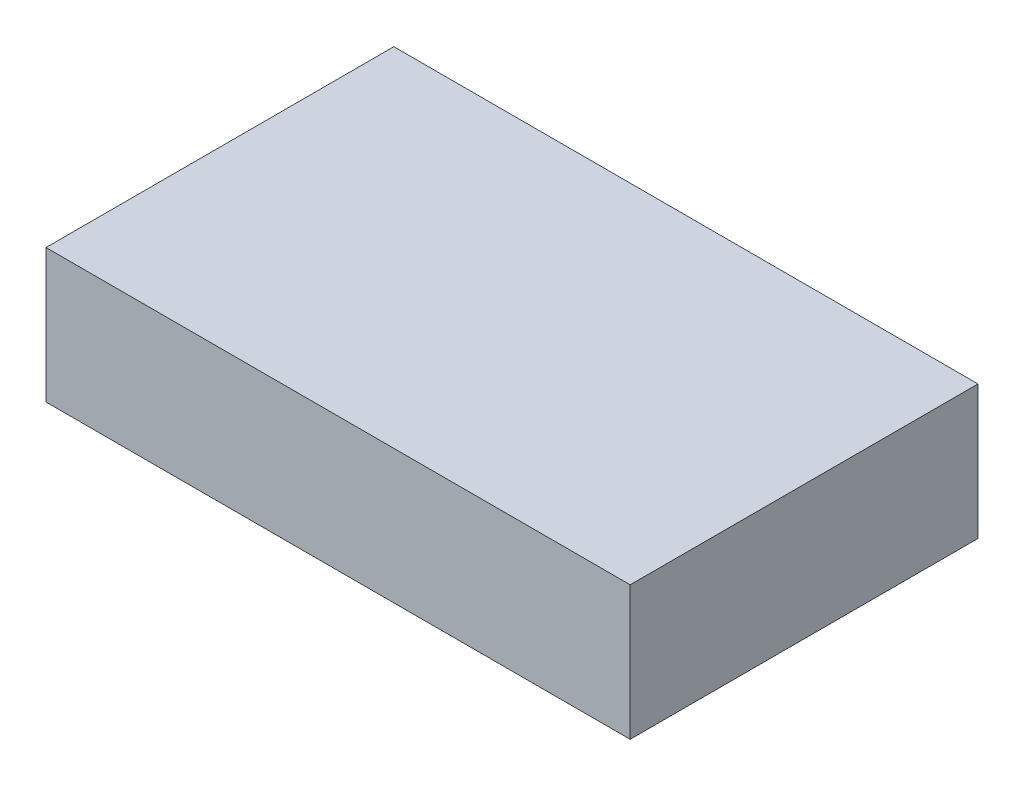
ISO-10303-21;
HEADER;
FILE_DESCRIPTION(('STEP AP214'),'2;1');
FILE_NAME('part.step','',(''),(''),'','','');
FILE_SCHEMA(('AUTOMOTIVE_DESIGN { 1 0 10303 214 1 1 1 1 }'));
ENDSEC;
DATA;
#1=APPLICATION_CONTEXT('core data for automotive mechanical design processes');
#2=APPLICATION_PROTOCOL_DEFINITION('international standard','automotive_design',2000,#1);
#3=PRODUCT_CONTEXT('',#1,'mechanical');
#4=PRODUCT('Part','Part','',(#3));
#5=PRODUCT_RELATED_PRODUCT_CATEGORY('part','',(#4));
#6=PRODUCT_DEFINITION_FORMATION('','',#4);
#7=PRODUCT_DEFINITION_CONTEXT('part definition',#1,'design');
#8=PRODUCT_DEFINITION('design','',#6,#7);
#9=PRODUCT_DEFINITION_SHAPE('','',#8);
#10=(LENGTH_UNIT() NAMED_UNIT(*) SI_UNIT(.MILLI.,.METRE.));
#11=(NAMED_UNIT(*) PLANE_ANGLE_UNIT() SI_UNIT($,.RADIAN.));
#12=(NAMED_UNIT(*) SI_UNIT($,.STERADIAN.) SOLID_ANGLE_UNIT());
#13=UNCERTAINTY_MEASURE_WITH_UNIT(LENGTH_MEASURE(1.E-05),#10,'distance_accuracy_value','');
#14=(GEOMETRIC_REPRESENTATION_CONTEXT(3) GLOBAL_UNCERTAINTY_ASSIGNED_CONTEXT((#13)) GLOBAL_UNIT_ASSIGNED_CONTEXT((#10,
#11,#12)) REPRESENTATION_CONTEXT('',''));
#15=CARTESIAN_POINT('',(0.,0.,0.));
#16=DIRECTION('',(0.,0.,1.));
#17=DIRECTION('',(1.,0.,0.));
#18=AXIS2_PLACEMENT_3D('',#15,#16,#17);
#19=CARTESIAN_POINT('',(55.,25.2,-32.75));
#20=DIRECTION('',(-1.,0.,0.));
#21=DIRECTION('',(0.,0.,1.));
#22=AXIS2_PLACEMENT_3D('',#19,#20,#21);
#23=PLANE('',#22);
#24=DIRECTION('',(0.,0.,-1.));
#25=VECTOR('',#24,1.);
#26=CARTESIAN_POINT('',(55.,0.,-32.75));
#27=LINE('',#26,#25);
#28=CARTESIAN_POINT('',(55.,0.,32.75));
#29=VERTEX_POINT('',#28);
#30=CARTESIAN_POINT('',(55.,0.,-32.75));
#31=VERTEX_POINT('',#30);
#32=EDGE_CURVE('E101',#29,#31,#27,.T.);
#33=ORIENTED_EDGE('',*,*,#32,.T.);
#34=DIRECTION('',(0.,-1.,0.));
#35=VECTOR('',#34,1.);
#36=CARTESIAN_POINT('',(55.,25.2,-32.75));
#37=LINE('',#36,#35);
#38=CARTESIAN_POINT('',(55.,25.2,-32.75));
#39=VERTEX_POINT('',#38);
#40=EDGE_CURVE('E11',#39,#31,#37,.T.);
#41=ORIENTED_EDGE('',*,*,#40,.F.);
#42=DIRECTION('',(0.,0.,-1.));
#43=VECTOR('',#42,1.);
#44=CARTESIAN_POINT('',(55.,25.2,-32.75));
#45=LINE('',#44,#43);
#46=CARTESIAN_POINT('',(55.,25.2,32.75));
#47=VERTEX_POINT('',#46);
#48=EDGE_CURVE('E95',#47,#39,#45,.T.);
#49=ORIENTED_EDGE('',*,*,#48,.F.);
#50=DIRECTION('',(0.,-1.,0.));
#51=VECTOR('',#50,1.);
#52=CARTESIAN_POINT('',(55.,25.2,32.75));
#53=LINE('',#52,#51);
#54=EDGE_CURVE('E99',#47,#29,#53,.T.);
#55=ORIENTED_EDGE('',*,*,#54,.T.);
#56=EDGE_LOOP('',(#33,#41,#49,#55));
#57=FACE_BOUND('',#56,.T.);
#58=ADVANCED_FACE('F41',(#57),#23,.F.);
#59=CARTESIAN_POINT('',(-55.,25.2,-32.75));
#60=DIRECTION('',(0.,0.,1.));
#61=DIRECTION('',(1.,0.,0.));
#62=AXIS2_PLACEMENT_3D('',#59,#60,#61);
#63=PLANE('',#62);
#64=DIRECTION('',(-1.,0.,0.));
#65=VECTOR('',#64,1.);
#66=CARTESIAN_POINT('',(-55.,0.,-32.75));
#67=LINE('',#66,#65);
#68=CARTESIAN_POINT('',(-55.,0.,-32.75));
#69=VERTEX_POINT('',#68);
#70=EDGE_CURVE('E96',#31,#69,#67,.T.);
#71=ORIENTED_EDGE('',*,*,#70,.T.);
#72=DIRECTION('',(0.,-1.,0.));
#73=VECTOR('',#72,1.);
#74=CARTESIAN_POINT('',(-55.,25.2,-32.75));
#75=LINE('',#74,#73);
#76=CARTESIAN_POINT('',(-55.,25.2,-32.75));
#77=VERTEX_POINT('',#76);
#78=EDGE_CURVE('E47',#77,#69,#75,.T.);
#79=ORIENTED_EDGE('',*,*,#78,.F.);
#80=DIRECTION('',(-1.,0.,0.));
#81=VECTOR('',#80,1.);
#82=CARTESIAN_POINT('',(-55.,25.2,-32.75));
#83=LINE('',#82,#81);
#84=EDGE_CURVE('E90',#39,#77,#83,.T.);
#85=ORIENTED_EDGE('',*,*,#84,.F.);
#86=ORIENTED_EDGE('',*,*,#40,.T.);
#87=EDGE_LOOP('',(#71,#79,#85,#86));
#88=FACE_BOUND('',#87,.T.);
#89=ADVANCED_FACE('F94',(#88),#63,.F.);
#90=CARTESIAN_POINT('',(-55.,25.2,-32.75));
#91=DIRECTION('',(1.,0.,0.));
#92=DIRECTION('',(0.,0.,-1.));
#93=AXIS2_PLACEMENT_3D('',#90,#91,#92);
#94=PLANE('',#93);
#95=DIRECTION('',(0.,0.,1.));
#96=VECTOR('',#95,1.);
#97=CARTESIAN_POINT('',(-55.,0.,-32.75));
#98=LINE('',#97,#96);
#99=CARTESIAN_POINT('',(-55.,0.,32.75));
#100=VERTEX_POINT('',#99);
#101=EDGE_CURVE('E73',#69,#100,#98,.T.);
#102=ORIENTED_EDGE('',*,*,#101,.T.);
#103=DIRECTION('',(0.,-1.,0.));
#104=VECTOR('',#103,1.);
#105=CARTESIAN_POINT('',(-55.,25.2,32.75));
#106=LINE('',#105,#104);
#107=CARTESIAN_POINT('',(-55.,25.2,32.75));
#108=VERTEX_POINT('',#107);
#109=EDGE_CURVE('E100',#108,#100,#106,.T.);
#110=ORIENTED_EDGE('',*,*,#109,.F.);
#111=DIRECTION('',(0.,0.,1.));
#112=VECTOR('',#111,1.);
#113=CARTESIAN_POINT('',(-55.,25.2,-32.75));
#114=LINE('',#113,#112);
#115=EDGE_CURVE('E89',#77,#108,#114,.T.);
#116=ORIENTED_EDGE('',*,*,#115,.F.);
#117=ORIENTED_EDGE('',*,*,#78,.T.);
#118=EDGE_LOOP('',(#102,#110,#116,#117));
#119=FACE_BOUND('',#118,.T.);
#120=ADVANCED_FACE('F97',(#119),#94,.F.);
#121=CARTESIAN_POINT('',(-55.,25.2,32.75));
#122=DIRECTION('',(0.,0.,-1.));
#123=DIRECTION('',(-1.,0.,0.));
#124=AXIS2_PLACEMENT_3D('',#121,#122,#123);
#125=PLANE('',#124);
#126=DIRECTION('',(1.,0.,0.));
#127=VECTOR('',#126,1.);
#128=CARTESIAN_POINT('',(-55.,0.,32.75));
#129=LINE('',#128,#127);
#130=EDGE_CURVE('E79',#100,#29,#129,.T.);
#131=ORIENTED_EDGE('',*,*,#130,.T.);
#132=ORIENTED_EDGE('',*,*,#54,.F.);
#133=DIRECTION('',(1.,0.,0.));
#134=VECTOR('',#133,1.);
#135=CARTESIAN_POINT('',(-55.,25.2,32.75));
#136=LINE('',#135,#134);
#137=EDGE_CURVE('E60',#108,#47,#136,.T.);
#138=ORIENTED_EDGE('',*,*,#137,.F.);
#139=ORIENTED_EDGE('',*,*,#109,.T.);
#140=EDGE_LOOP('',(#131,#132,#138,#139));
#141=FACE_BOUND('',#140,.T.);
#142=ADVANCED_FACE('F112',(#141),#125,.F.);
#143=CARTESIAN_POINT('',(0.,25.2,0.));
#144=DIRECTION('',(0.,1.,0.));
#145=DIRECTION('',(0.,0.,1.));
#146=AXIS2_PLACEMENT_3D('',#143,#144,#145);
#147=PLANE('',#146);
#148=ORIENTED_EDGE('',*,*,#48,.T.);
#149=ORIENTED_EDGE('',*,*,#84,.T.);
#150=ORIENTED_EDGE('',*,*,#115,.T.);
#151=ORIENTED_EDGE('',*,*,#137,.T.);
#152=EDGE_LOOP('',(#148,#149,#150,#151));
#153=FACE_BOUND('',#152,.T.);
#154=ADVANCED_FACE('F88',(#153),#147,.T.);
#155=CARTESIAN_POINT('',(0.,0.,0.));
#156=DIRECTION('',(0.,1.,0.));
#157=DIRECTION('',(0.,0.,1.));
#158=AXIS2_PLACEMENT_3D('',#155,#156,#157);
#159=PLANE('',#158);
#160=ORIENTED_EDGE('',*,*,#32,.F.);
#161=ORIENTED_EDGE('',*,*,#130,.F.);
#162=ORIENTED_EDGE('',*,*,#101,.F.);
#163=ORIENTED_EDGE('',*,*,#70,.F.);
#164=EDGE_LOOP('',(#160,#161,#162,#163));
#165=FACE_BOUND('',#164,.T.);
#166=ADVANCED_FACE('F114',(#165),#159,.F.);
#167=CLOSED_SHELL('',(#58,#89,#120,#142,#154,#166));
#168=MANIFOLD_SOLID_BREP('B2',#167);
#169=ADVANCED_BREP_SHAPE_REPRESENTATION('',(#18,#168),#14);
#170=SHAPE_DEFINITION_REPRESENTATION(#9,#169);
ENDSEC;
END-ISO-10303-21;
